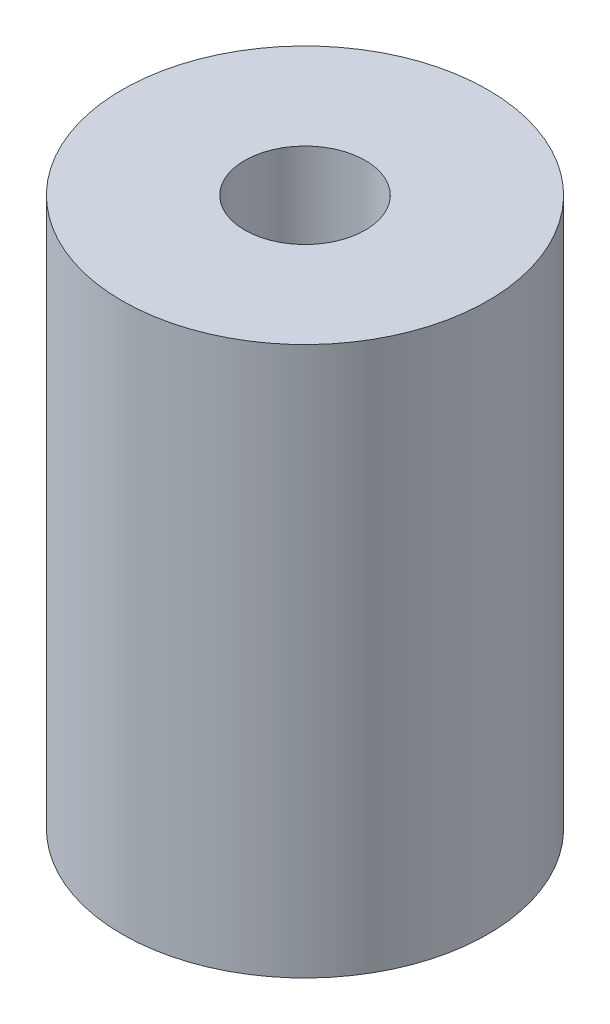
ISO-10303-21;
HEADER;
FILE_DESCRIPTION(('STEP AP214'),'2;1');
FILE_NAME('part.step','',(''),(''),'','','');
FILE_SCHEMA(('AUTOMOTIVE_DESIGN { 1 0 10303 214 1 1 1 1 }'));
ENDSEC;
DATA;
#1=APPLICATION_CONTEXT('core data for automotive mechanical design processes');
#2=APPLICATION_PROTOCOL_DEFINITION('international standard','automotive_design',2000,#1);
#3=PRODUCT_CONTEXT('',#1,'mechanical');
#4=PRODUCT('Part','Part','',(#3));
#5=PRODUCT_RELATED_PRODUCT_CATEGORY('part','',(#4));
#6=PRODUCT_DEFINITION_FORMATION('','',#4);
#7=PRODUCT_DEFINITION_CONTEXT('part definition',#1,'design');
#8=PRODUCT_DEFINITION('design','',#6,#7);
#9=PRODUCT_DEFINITION_SHAPE('','',#8);
#10=(LENGTH_UNIT() NAMED_UNIT(*) SI_UNIT(.MILLI.,.METRE.));
#11=(NAMED_UNIT(*) PLANE_ANGLE_UNIT() SI_UNIT($,.RADIAN.));
#12=(NAMED_UNIT(*) SI_UNIT($,.STERADIAN.) SOLID_ANGLE_UNIT());
#13=UNCERTAINTY_MEASURE_WITH_UNIT(LENGTH_MEASURE(1.E-05),#10,'distance_accuracy_value','');
#14=(GEOMETRIC_REPRESENTATION_CONTEXT(3) GLOBAL_UNCERTAINTY_ASSIGNED_CONTEXT((#13)) GLOBAL_UNIT_ASSIGNED_CONTEXT((#10,
#11,#12)) REPRESENTATION_CONTEXT('',''));
#15=CARTESIAN_POINT('',(0.,0.,0.));
#16=DIRECTION('',(0.,0.,1.));
#17=DIRECTION('',(1.,0.,0.));
#18=AXIS2_PLACEMENT_3D('',#15,#16,#17);
#19=CARTESIAN_POINT('',(0.,15.,0.));
#20=DIRECTION('',(0.,1.,0.));
#21=DIRECTION('',(0.,0.,1.));
#22=AXIS2_PLACEMENT_3D('',#19,#20,#21);
#23=PLANE('',#22);
#24=CARTESIAN_POINT('',(0.,15.,0.));
#25=DIRECTION('',(0.,1.,0.));
#26=DIRECTION('',(0.,0.,1.));
#27=AXIS2_PLACEMENT_3D('',#24,#25,#26);
#28=CIRCLE('',#27,5.);
#29=CARTESIAN_POINT('',(0.,15.,5.));
#30=VERTEX_POINT('',#29);
#31=EDGE_CURVE('E10',#30,#30,#28,.T.);
#32=ORIENTED_EDGE('',*,*,#31,.T.);
#33=EDGE_LOOP('',(#32));
#34=FACE_BOUND('',#33,.T.);
#35=CARTESIAN_POINT('',(0.,15.,0.));
#36=DIRECTION('',(0.,1.,0.));
#37=DIRECTION('',(0.,0.,1.));
#38=AXIS2_PLACEMENT_3D('',#35,#36,#37);
#39=CIRCLE('',#38,1.65);
#40=CARTESIAN_POINT('',(0.,15.,1.65));
#41=VERTEX_POINT('',#40);
#42=EDGE_CURVE('E41',#41,#41,#39,.T.);
#43=ORIENTED_EDGE('',*,*,#42,.F.);
#44=EDGE_LOOP('',(#43));
#45=FACE_BOUND('',#44,.T.);
#46=ADVANCED_FACE('F30',(#34,#45),#23,.T.);
#47=CARTESIAN_POINT('',(0.,0.,0.));
#48=DIRECTION('',(0.,1.,0.));
#49=DIRECTION('',(0.,0.,1.));
#50=AXIS2_PLACEMENT_3D('',#47,#48,#49);
#51=PLANE('',#50);
#52=CARTESIAN_POINT('',(0.,0.,0.));
#53=DIRECTION('',(0.,1.,0.));
#54=DIRECTION('',(0.,0.,1.));
#55=AXIS2_PLACEMENT_3D('',#52,#53,#54);
#56=CIRCLE('',#55,5.);
#57=CARTESIAN_POINT('',(0.,0.,5.));
#58=VERTEX_POINT('',#57);
#59=EDGE_CURVE('E34',#58,#58,#56,.T.);
#60=ORIENTED_EDGE('',*,*,#59,.F.);
#61=EDGE_LOOP('',(#60));
#62=FACE_BOUND('',#61,.T.);
#63=CARTESIAN_POINT('',(0.,0.,0.));
#64=DIRECTION('',(0.,1.,0.));
#65=DIRECTION('',(0.,0.,1.));
#66=AXIS2_PLACEMENT_3D('',#63,#64,#65);
#67=CIRCLE('',#66,1.65);
#68=CARTESIAN_POINT('',(0.,0.,1.65));
#69=VERTEX_POINT('',#68);
#70=EDGE_CURVE('E43',#69,#69,#67,.T.);
#71=ORIENTED_EDGE('',*,*,#70,.T.);
#72=EDGE_LOOP('',(#71));
#73=FACE_BOUND('',#72,.T.);
#74=ADVANCED_FACE('F53',(#62,#73),#51,.F.);
#75=CARTESIAN_POINT('',(0.,15.,0.));
#76=DIRECTION('',(0.,-1.,0.));
#77=DIRECTION('',(0.,0.,-1.));
#78=AXIS2_PLACEMENT_3D('',#75,#76,#77);
#79=CYLINDRICAL_SURFACE('',#78,5.);
#80=ORIENTED_EDGE('',*,*,#31,.F.);
#81=EDGE_LOOP('',(#80));
#82=FACE_BOUND('',#81,.T.);
#83=ORIENTED_EDGE('',*,*,#59,.T.);
#84=EDGE_LOOP('',(#83));
#85=FACE_BOUND('',#84,.T.);
#86=ADVANCED_FACE('F32',(#82,#85),#79,.T.);
#87=CARTESIAN_POINT('',(0.,15.,0.));
#88=DIRECTION('',(0.,-1.,0.));
#89=DIRECTION('',(0.,0.,-1.));
#90=AXIS2_PLACEMENT_3D('',#87,#88,#89);
#91=CYLINDRICAL_SURFACE('',#90,1.65);
#92=ORIENTED_EDGE('',*,*,#42,.T.);
#93=EDGE_LOOP('',(#92));
#94=FACE_BOUND('',#93,.T.);
#95=ORIENTED_EDGE('',*,*,#70,.F.);
#96=EDGE_LOOP('',(#95));
#97=FACE_BOUND('',#96,.T.);
#98=ADVANCED_FACE('F49',(#94,#97),#91,.F.);
#99=CLOSED_SHELL('',(#46,#74,#86,#98));
#100=MANIFOLD_SOLID_BREP('B2',#99);
#101=ADVANCED_BREP_SHAPE_REPRESENTATION('',(#18,#100),#14);
#102=SHAPE_DEFINITION_REPRESENTATION(#9,#101);
ENDSEC;
END-ISO-10303-21;
